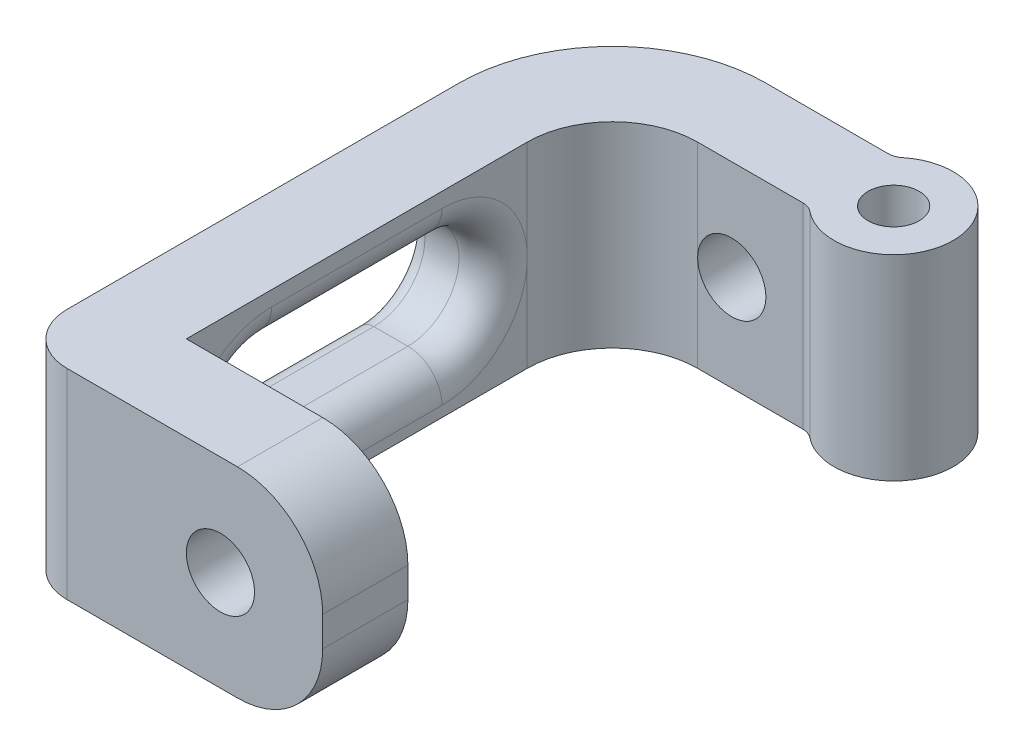
ISO-10303-21;
HEADER;
FILE_DESCRIPTION(('STEP AP214'),'2;1');
FILE_NAME('part.step','',(''),(''),'','','');
FILE_SCHEMA(('AUTOMOTIVE_DESIGN { 1 0 10303 214 1 1 1 1 }'));
ENDSEC;
DATA;
#1=APPLICATION_CONTEXT('core data for automotive mechanical design processes');
#2=APPLICATION_PROTOCOL_DEFINITION('international standard','automotive_design',2000,#1);
#3=PRODUCT_CONTEXT('',#1,'mechanical');
#4=PRODUCT('Part','Part','',(#3));
#5=PRODUCT_RELATED_PRODUCT_CATEGORY('part','',(#4));
#6=PRODUCT_DEFINITION_FORMATION('','',#4);
#7=PRODUCT_DEFINITION_CONTEXT('part definition',#1,'design');
#8=PRODUCT_DEFINITION('design','',#6,#7);
#9=PRODUCT_DEFINITION_SHAPE('','',#8);
#10=(LENGTH_UNIT() NAMED_UNIT(*) SI_UNIT(.MILLI.,.METRE.));
#11=(NAMED_UNIT(*) PLANE_ANGLE_UNIT() SI_UNIT($,.RADIAN.));
#12=(NAMED_UNIT(*) SI_UNIT($,.STERADIAN.) SOLID_ANGLE_UNIT());
#13=UNCERTAINTY_MEASURE_WITH_UNIT(LENGTH_MEASURE(1.E-05),#10,'distance_accuracy_value','');
#14=(GEOMETRIC_REPRESENTATION_CONTEXT(3) GLOBAL_UNCERTAINTY_ASSIGNED_CONTEXT((#13)) GLOBAL_UNIT_ASSIGNED_CONTEXT((#10,
#11,#12)) REPRESENTATION_CONTEXT('',''));
#15=CARTESIAN_POINT('',(0.,0.,0.));
#16=DIRECTION('',(0.,0.,1.));
#17=DIRECTION('',(1.,0.,0.));
#18=AXIS2_PLACEMENT_3D('',#15,#16,#17);
#19=CARTESIAN_POINT('',(-5.,5.75,30.));
#20=DIRECTION('',(-1.,0.,0.));
#21=DIRECTION('',(0.,-1.,0.));
#22=AXIS2_PLACEMENT_3D('',#19,#20,#21);
#23=PLANE('',#22);
#24=DIRECTION('',(0.,0.,-1.));
#25=VECTOR('',#24,1.);
#26=CARTESIAN_POINT('',(-5.,-5.75,30.));
#27=LINE('',#26,#25);
#28=CARTESIAN_POINT('',(-5.,-5.75,30.));
#29=VERTEX_POINT('',#28);
#30=CARTESIAN_POINT('',(-5.,-5.75,10.));
#31=VERTEX_POINT('',#30);
#32=EDGE_CURVE('E253',#29,#31,#27,.T.);
#33=ORIENTED_EDGE('',*,*,#32,.T.);
#34=DIRECTION('',(0.,1.,0.));
#35=VECTOR('',#34,1.);
#36=CARTESIAN_POINT('',(-5.,5.75,10.));
#37=LINE('',#36,#35);
#38=CARTESIAN_POINT('',(-5.,-0.124999999999997,10.));
#39=VERTEX_POINT('',#38);
#40=EDGE_CURVE('E386',#31,#39,#37,.T.);
#41=ORIENTED_EDGE('',*,*,#40,.T.);
#42=CARTESIAN_POINT('',(-5.,-0.124999999999997,15.));
#43=DIRECTION('',(-1.,0.,0.));
#44=DIRECTION('',(0.,-1.,0.));
#45=AXIS2_PLACEMENT_3D('',#42,#43,#44);
#46=CIRCLE('',#45,5.);
#47=CARTESIAN_POINT('',(-5.,-5.125,15.));
#48=VERTEX_POINT('',#47);
#49=EDGE_CURVE('E334',#39,#48,#46,.T.);
#50=ORIENTED_EDGE('',*,*,#49,.T.);
#51=DIRECTION('',(0.,0.,1.));
#52=VECTOR('',#51,1.);
#53=CARTESIAN_POINT('',(-5.,-5.125,30.));
#54=LINE('',#53,#52);
#55=CARTESIAN_POINT('',(-5.,-5.125,25.));
#56=VERTEX_POINT('',#55);
#57=EDGE_CURVE('E317',#48,#56,#54,.T.);
#58=ORIENTED_EDGE('',*,*,#57,.T.);
#59=CARTESIAN_POINT('',(-5.,-0.124999999999997,25.));
#60=DIRECTION('',(-1.,0.,0.));
#61=DIRECTION('',(0.,-1.,0.));
#62=AXIS2_PLACEMENT_3D('',#59,#60,#61);
#63=CIRCLE('',#62,5.);
#64=CARTESIAN_POINT('',(-5.,-0.124999999999997,30.));
#65=VERTEX_POINT('',#64);
#66=EDGE_CURVE('E332',#56,#65,#63,.T.);
#67=ORIENTED_EDGE('',*,*,#66,.T.);
#68=DIRECTION('',(0.,1.,0.));
#69=VECTOR('',#68,1.);
#70=CARTESIAN_POINT('',(-5.,5.75,30.));
#71=LINE('',#70,#69);
#72=EDGE_CURVE('E247',#29,#65,#71,.T.);
#73=ORIENTED_EDGE('',*,*,#72,.F.);
#74=EDGE_LOOP('',(#33,#41,#50,#58,#67,#73));
#75=FACE_BOUND('',#74,.T.);
#76=ADVANCED_FACE('F45',(#75),#23,.F.);
#77=CARTESIAN_POINT('',(-10.,5.75,5.));
#78=DIRECTION('',(0.,-1.,0.));
#79=DIRECTION('',(0.,0.,-1.));
#80=AXIS2_PLACEMENT_3D('',#77,#78,#79);
#81=PLANE('',#80);
#82=CARTESIAN_POINT('',(9.,5.75,2.5));
#83=DIRECTION('',(0.,-1.,0.));
#84=DIRECTION('',(0.,0.,-1.));
#85=AXIS2_PLACEMENT_3D('',#82,#83,#84);
#86=CIRCLE('',#85,1.5);
#87=CARTESIAN_POINT('',(9.,5.75,1.));
#88=VERTEX_POINT('',#87);
#89=EDGE_CURVE('E356',#88,#88,#86,.T.);
#90=ORIENTED_EDGE('',*,*,#89,.T.);
#91=EDGE_LOOP('',(#90));
#92=FACE_BOUND('',#91,.T.);
#93=DIRECTION('',(0.,0.,-1.));
#94=VECTOR('',#93,1.);
#95=CARTESIAN_POINT('',(-10.,5.75,5.));
#96=LINE('',#95,#94);
#97=CARTESIAN_POINT('',(-10.,5.75,32.));
#98=VERTEX_POINT('',#97);
#99=CARTESIAN_POINT('',(-10.,5.75,9.));
#100=VERTEX_POINT('',#99);
#101=EDGE_CURVE('E267',#98,#100,#96,.T.);
#102=ORIENTED_EDGE('',*,*,#101,.F.);
#103=CARTESIAN_POINT('',(-7.,5.75,32.));
#104=DIRECTION('',(0.,-1.,0.));
#105=DIRECTION('',(0.,0.,-1.));
#106=AXIS2_PLACEMENT_3D('',#103,#104,#105);
#107=CIRCLE('',#106,3.);
#108=CARTESIAN_POINT('',(-7.,5.75,35.));
#109=VERTEX_POINT('',#108);
#110=EDGE_CURVE('E12',#98,#109,#107,.F.);
#111=ORIENTED_EDGE('',*,*,#110,.T.);
#112=DIRECTION('',(-1.,0.,0.));
#113=VECTOR('',#112,1.);
#114=CARTESIAN_POINT('',(-10.,5.75,35.));
#115=LINE('',#114,#113);
#116=CARTESIAN_POINT('',(3.,5.75,35.));
#117=VERTEX_POINT('',#116);
#118=EDGE_CURVE('E219',#117,#109,#115,.T.);
#119=ORIENTED_EDGE('',*,*,#118,.F.);
#120=DIRECTION('',(0.,0.,-1.));
#121=VECTOR('',#120,1.);
#122=CARTESIAN_POINT('',(3.,5.75,5.));
#123=LINE('',#122,#121);
#124=CARTESIAN_POINT('',(3.,5.75,30.));
#125=VERTEX_POINT('',#124);
#126=EDGE_CURVE('E293',#117,#125,#123,.T.);
#127=ORIENTED_EDGE('',*,*,#126,.T.);
#128=DIRECTION('',(-1.,0.,0.));
#129=VECTOR('',#128,1.);
#130=CARTESIAN_POINT('',(-10.,5.75,30.));
#131=LINE('',#130,#129);
#132=CARTESIAN_POINT('',(-5.,5.75,30.));
#133=VERTEX_POINT('',#132);
#134=EDGE_CURVE('E238',#125,#133,#131,.T.);
#135=ORIENTED_EDGE('',*,*,#134,.T.);
#136=DIRECTION('',(0.,0.,-1.));
#137=VECTOR('',#136,1.);
#138=CARTESIAN_POINT('',(-5.,5.75,30.));
#139=LINE('',#138,#137);
#140=CARTESIAN_POINT('',(-5.,5.75,10.));
#141=VERTEX_POINT('',#140);
#142=EDGE_CURVE('E250',#133,#141,#139,.T.);
#143=ORIENTED_EDGE('',*,*,#142,.T.);
#144=CARTESIAN_POINT('',(0.,5.75,10.));
#145=DIRECTION('',(0.,-1.,0.));
#146=DIRECTION('',(0.,0.,-1.));
#147=AXIS2_PLACEMENT_3D('',#144,#145,#146);
#148=CIRCLE('',#147,5.);
#149=CARTESIAN_POINT('',(0.,5.75,5.));
#150=VERTEX_POINT('',#149);
#151=EDGE_CURVE('E393',#141,#150,#148,.T.);
#152=ORIENTED_EDGE('',*,*,#151,.T.);
#153=DIRECTION('',(-1.,0.,0.));
#154=VECTOR('',#153,1.);
#155=CARTESIAN_POINT('',(-10.,5.75,5.));
#156=LINE('',#155,#154);
#157=CARTESIAN_POINT('',(6.17157287525381,5.75,5.));
#158=VERTEX_POINT('',#157);
#159=EDGE_CURVE('E257',#158,#150,#156,.T.);
#160=ORIENTED_EDGE('',*,*,#159,.F.);
#161=CARTESIAN_POINT('',(6.17157287525381,5.75,6.));
#162=DIRECTION('',(0.,-1.,0.));
#163=DIRECTION('',(0.,0.,-1.));
#164=AXIS2_PLACEMENT_3D('',#161,#162,#163);
#165=CIRCLE('',#164,1.);
#166=CARTESIAN_POINT('',(6.80011223630852,5.75,5.22222222222222));
#167=VERTEX_POINT('',#166);
#168=EDGE_CURVE('E382',#158,#167,#165,.T.);
#169=ORIENTED_EDGE('',*,*,#168,.T.);
#170=CARTESIAN_POINT('',(9.,5.75,2.5));
#171=DIRECTION('',(0.,-1.,0.));
#172=DIRECTION('',(0.,0.,-1.));
#173=AXIS2_PLACEMENT_3D('',#170,#171,#172);
#174=CIRCLE('',#173,3.5);
#175=CARTESIAN_POINT('',(6.80011223630852,5.75,-0.222222222222222));
#176=VERTEX_POINT('',#175);
#177=EDGE_CURVE('E433',#176,#167,#174,.T.);
#178=ORIENTED_EDGE('',*,*,#177,.F.);
#179=CARTESIAN_POINT('',(6.17157287525381,5.75,-1.));
#180=DIRECTION('',(0.,-1.,0.));
#181=DIRECTION('',(0.,0.,-1.));
#182=AXIS2_PLACEMENT_3D('',#179,#180,#181);
#183=CIRCLE('',#182,1.);
#184=CARTESIAN_POINT('',(6.17157287525381,5.75,0.));
#185=VERTEX_POINT('',#184);
#186=EDGE_CURVE('E377',#176,#185,#183,.T.);
#187=ORIENTED_EDGE('',*,*,#186,.T.);
#188=DIRECTION('',(-1.,0.,0.));
#189=VECTOR('',#188,1.);
#190=CARTESIAN_POINT('',(-10.,5.75,0.));
#191=LINE('',#190,#189);
#192=CARTESIAN_POINT('',(-1.,5.75,0.));
#193=VERTEX_POINT('',#192);
#194=EDGE_CURVE('E256',#185,#193,#191,.T.);
#195=ORIENTED_EDGE('',*,*,#194,.T.);
#196=CARTESIAN_POINT('',(-1.,5.75,9.));
#197=DIRECTION('',(0.,-1.,0.));
#198=DIRECTION('',(0.,0.,-1.));
#199=AXIS2_PLACEMENT_3D('',#196,#197,#198);
#200=CIRCLE('',#199,9.);
#201=EDGE_CURVE('E276',#193,#100,#200,.F.);
#202=ORIENTED_EDGE('',*,*,#201,.T.);
#203=EDGE_LOOP('',(#102,#111,#119,#127,#135,#143,#152,#160,#169,#178,#187,#195,#202));
#204=FACE_BOUND('',#203,.T.);
#205=ADVANCED_FACE('F458',(#92,#204),#81,.F.);
#206=CARTESIAN_POINT('',(-10.,5.75,5.));
#207=DIRECTION('',(1.,0.,0.));
#208=DIRECTION('',(0.,0.,-1.));
#209=AXIS2_PLACEMENT_3D('',#206,#207,#208);
#210=PLANE('',#209);
#211=CARTESIAN_POINT('',(-10.,-0.124999999999998,25.));
#212=DIRECTION('',(1.,0.,0.));
#213=DIRECTION('',(0.,0.,-1.));
#214=AXIS2_PLACEMENT_3D('',#211,#212,#213);
#215=CIRCLE('',#214,4.);
#216=CARTESIAN_POINT('',(-10.,3.875,25.));
#217=VERTEX_POINT('',#216);
#218=CARTESIAN_POINT('',(-10.,-4.125,25.));
#219=VERTEX_POINT('',#218);
#220=EDGE_CURVE('E299',#217,#219,#215,.T.);
#221=ORIENTED_EDGE('',*,*,#220,.T.);
#222=DIRECTION('',(0.,0.,1.));
#223=VECTOR('',#222,1.);
#224=CARTESIAN_POINT('',(-10.,-4.125,5.));
#225=LINE('',#224,#223);
#226=CARTESIAN_POINT('',(-10.,-4.125,15.));
#227=VERTEX_POINT('',#226);
#228=EDGE_CURVE('E305',#219,#227,#225,.F.);
#229=ORIENTED_EDGE('',*,*,#228,.T.);
#230=CARTESIAN_POINT('',(-10.,-0.124999999999998,15.));
#231=DIRECTION('',(1.,0.,0.));
#232=DIRECTION('',(0.,0.,-1.));
#233=AXIS2_PLACEMENT_3D('',#230,#231,#232);
#234=CIRCLE('',#233,4.);
#235=CARTESIAN_POINT('',(-10.,3.875,15.));
#236=VERTEX_POINT('',#235);
#237=EDGE_CURVE('E303',#227,#236,#234,.T.);
#238=ORIENTED_EDGE('',*,*,#237,.T.);
#239=DIRECTION('',(0.,0.,-1.));
#240=VECTOR('',#239,1.);
#241=CARTESIAN_POINT('',(-10.,3.875,5.));
#242=LINE('',#241,#240);
#243=EDGE_CURVE('E301',#236,#217,#242,.F.);
#244=ORIENTED_EDGE('',*,*,#243,.T.);
#245=EDGE_LOOP('',(#221,#229,#238,#244));
#246=FACE_BOUND('',#245,.T.);
#247=DIRECTION('',(0.,0.,-1.));
#248=VECTOR('',#247,1.);
#249=CARTESIAN_POINT('',(-10.,-6.,35.));
#250=LINE('',#249,#248);
#251=CARTESIAN_POINT('',(-10.,-6.,32.));
#252=VERTEX_POINT('',#251);
#253=CARTESIAN_POINT('',(-10.,-6.,30.));
#254=VERTEX_POINT('',#253);
#255=EDGE_CURVE('E211',#252,#254,#250,.T.);
#256=ORIENTED_EDGE('',*,*,#255,.F.);
#257=DIRECTION('',(0.,-1.,0.));
#258=VECTOR('',#257,1.);
#259=CARTESIAN_POINT('',(-10.,5.75,32.));
#260=LINE('',#259,#258);
#261=EDGE_CURVE('E53',#252,#98,#260,.F.);
#262=ORIENTED_EDGE('',*,*,#261,.T.);
#263=ORIENTED_EDGE('',*,*,#101,.T.);
#264=DIRECTION('',(0.,-1.,0.));
#265=VECTOR('',#264,1.);
#266=CARTESIAN_POINT('',(-10.,5.75,9.));
#267=LINE('',#266,#265);
#268=CARTESIAN_POINT('',(-10.,-5.75,9.));
#269=VERTEX_POINT('',#268);
#270=EDGE_CURVE('E269',#100,#269,#267,.T.);
#271=ORIENTED_EDGE('',*,*,#270,.T.);
#272=DIRECTION('',(0.,0.,-1.));
#273=VECTOR('',#272,1.);
#274=CARTESIAN_POINT('',(-10.,-5.75,5.));
#275=LINE('',#274,#273);
#276=CARTESIAN_POINT('',(-10.,-5.75,30.));
#277=VERTEX_POINT('',#276);
#278=EDGE_CURVE('E226',#277,#269,#275,.T.);
#279=ORIENTED_EDGE('',*,*,#278,.F.);
#280=DIRECTION('',(0.,-1.,0.));
#281=VECTOR('',#280,1.);
#282=CARTESIAN_POINT('',(-10.,5.75,30.));
#283=LINE('',#282,#281);
#284=EDGE_CURVE('E222',#277,#254,#283,.T.);
#285=ORIENTED_EDGE('',*,*,#284,.T.);
#286=EDGE_LOOP('',(#256,#262,#263,#271,#279,#285));
#287=FACE_BOUND('',#286,.T.);
#288=ADVANCED_FACE('F223',(#246,#287),#210,.F.);
#289=CARTESIAN_POINT('',(-10.,-5.75,5.));
#290=DIRECTION('',(0.,1.,0.));
#291=DIRECTION('',(0.,0.,1.));
#292=AXIS2_PLACEMENT_3D('',#289,#290,#291);
#293=PLANE('',#292);
#294=CARTESIAN_POINT('',(9.,-5.75,2.5));
#295=DIRECTION('',(0.,1.,0.));
#296=DIRECTION('',(0.,0.,1.));
#297=AXIS2_PLACEMENT_3D('',#294,#295,#296);
#298=CIRCLE('',#297,1.5);
#299=CARTESIAN_POINT('',(9.,-5.75,4.));
#300=VERTEX_POINT('',#299);
#301=EDGE_CURVE('E351',#300,#300,#298,.T.);
#302=ORIENTED_EDGE('',*,*,#301,.T.);
#303=EDGE_LOOP('',(#302));
#304=FACE_BOUND('',#303,.T.);
#305=DIRECTION('',(1.,0.,0.));
#306=VECTOR('',#305,1.);
#307=CARTESIAN_POINT('',(-10.,-5.75,0.));
#308=LINE('',#307,#306);
#309=CARTESIAN_POINT('',(-1.,-5.75,0.));
#310=VERTEX_POINT('',#309);
#311=CARTESIAN_POINT('',(6.17157287525381,-5.75,0.));
#312=VERTEX_POINT('',#311);
#313=EDGE_CURVE('E261',#310,#312,#308,.T.);
#314=ORIENTED_EDGE('',*,*,#313,.T.);
#315=CARTESIAN_POINT('',(6.17157287525381,-5.75,-1.));
#316=DIRECTION('',(0.,1.,0.));
#317=DIRECTION('',(0.,0.,1.));
#318=AXIS2_PLACEMENT_3D('',#315,#316,#317);
#319=CIRCLE('',#318,1.);
#320=CARTESIAN_POINT('',(6.80011223630852,-5.75,-0.222222222222222));
#321=VERTEX_POINT('',#320);
#322=EDGE_CURVE('E375',#312,#321,#319,.T.);
#323=ORIENTED_EDGE('',*,*,#322,.T.);
#324=CARTESIAN_POINT('',(9.,-5.75,2.5));
#325=DIRECTION('',(0.,-1.,0.));
#326=DIRECTION('',(0.,0.,-1.));
#327=AXIS2_PLACEMENT_3D('',#324,#325,#326);
#328=CIRCLE('',#327,3.5);
#329=CARTESIAN_POINT('',(6.80011223630852,-5.75,5.22222222222222));
#330=VERTEX_POINT('',#329);
#331=EDGE_CURVE('E434',#321,#330,#328,.T.);
#332=ORIENTED_EDGE('',*,*,#331,.T.);
#333=CARTESIAN_POINT('',(6.17157287525381,-5.75,6.));
#334=DIRECTION('',(0.,1.,0.));
#335=DIRECTION('',(0.,0.,1.));
#336=AXIS2_PLACEMENT_3D('',#333,#334,#335);
#337=CIRCLE('',#336,1.);
#338=CARTESIAN_POINT('',(6.17157287525381,-5.75,5.));
#339=VERTEX_POINT('',#338);
#340=EDGE_CURVE('E379',#330,#339,#337,.T.);
#341=ORIENTED_EDGE('',*,*,#340,.T.);
#342=DIRECTION('',(1.,0.,0.));
#343=VECTOR('',#342,1.);
#344=CARTESIAN_POINT('',(-10.,-5.75,5.));
#345=LINE('',#344,#343);
#346=CARTESIAN_POINT('',(0.,-5.75,5.));
#347=VERTEX_POINT('',#346);
#348=EDGE_CURVE('E260',#347,#339,#345,.T.);
#349=ORIENTED_EDGE('',*,*,#348,.F.);
#350=CARTESIAN_POINT('',(0.,-5.75,10.));
#351=DIRECTION('',(0.,1.,0.));
#352=DIRECTION('',(0.,0.,1.));
#353=AXIS2_PLACEMENT_3D('',#350,#351,#352);
#354=CIRCLE('',#353,5.);
#355=EDGE_CURVE('E395',#347,#31,#354,.T.);
#356=ORIENTED_EDGE('',*,*,#355,.T.);
#357=ORIENTED_EDGE('',*,*,#32,.F.);
#358=DIRECTION('',(1.,0.,0.));
#359=VECTOR('',#358,1.);
#360=CARTESIAN_POINT('',(-10.,-5.75,30.));
#361=LINE('',#360,#359);
#362=EDGE_CURVE('E218',#277,#29,#361,.T.);
#363=ORIENTED_EDGE('',*,*,#362,.F.);
#364=ORIENTED_EDGE('',*,*,#278,.T.);
#365=CARTESIAN_POINT('',(-1.,-5.75,9.));
#366=DIRECTION('',(0.,1.,0.));
#367=DIRECTION('',(0.,0.,1.));
#368=AXIS2_PLACEMENT_3D('',#365,#366,#367);
#369=CIRCLE('',#368,9.);
#370=EDGE_CURVE('E271',#269,#310,#369,.F.);
#371=ORIENTED_EDGE('',*,*,#370,.T.);
#372=EDGE_LOOP('',(#314,#323,#332,#341,#349,#356,#357,#363,#364,#371));
#373=FACE_BOUND('',#372,.T.);
#374=ADVANCED_FACE('F452',(#304,#373),#293,.F.);
#375=CARTESIAN_POINT('',(0.,0.,5.));
#376=DIRECTION('',(0.,0.,1.));
#377=DIRECTION('',(1.,0.,0.));
#378=AXIS2_PLACEMENT_3D('',#375,#376,#377);
#379=PLANE('',#378);
#380=ORIENTED_EDGE('',*,*,#159,.T.);
#381=DIRECTION('',(0.,1.,0.));
#382=VECTOR('',#381,1.);
#383=CARTESIAN_POINT('',(0.,0.,5.));
#384=LINE('',#383,#382);
#385=CARTESIAN_POINT('',(0.,-0.125000000000001,5.));
#386=VERTEX_POINT('',#385);
#387=EDGE_CURVE('E391',#150,#386,#384,.F.);
#388=ORIENTED_EDGE('',*,*,#387,.T.);
#389=CARTESIAN_POINT('',(2.,-0.125000000000001,5.));
#390=DIRECTION('',(0.,0.,1.));
#391=DIRECTION('',(1.,0.,0.));
#392=AXIS2_PLACEMENT_3D('',#389,#390,#391);
#393=CIRCLE('',#392,2.);
#394=EDGE_CURVE('E416',#386,#386,#393,.T.);
#395=ORIENTED_EDGE('',*,*,#394,.F.);
#396=DIRECTION('',(0.,1.,0.));
#397=VECTOR('',#396,1.);
#398=CARTESIAN_POINT('',(0.,0.,5.));
#399=LINE('',#398,#397);
#400=EDGE_CURVE('E389',#386,#347,#399,.F.);
#401=ORIENTED_EDGE('',*,*,#400,.T.);
#402=ORIENTED_EDGE('',*,*,#348,.T.);
#403=DIRECTION('',(0.,1.,0.));
#404=VECTOR('',#403,1.);
#405=CARTESIAN_POINT('',(6.17157287525381,5.75,5.));
#406=LINE('',#405,#404);
#407=EDGE_CURVE('E373',#339,#158,#406,.T.);
#408=ORIENTED_EDGE('',*,*,#407,.T.);
#409=EDGE_LOOP('',(#380,#388,#395,#401,#402,#408));
#410=FACE_BOUND('',#409,.T.);
#411=ADVANCED_FACE('F497',(#410),#379,.T.);
#412=CARTESIAN_POINT('',(0.,0.,0.));
#413=DIRECTION('',(0.,0.,1.));
#414=DIRECTION('',(1.,0.,0.));
#415=AXIS2_PLACEMENT_3D('',#412,#413,#414);
#416=PLANE('',#415);
#417=CARTESIAN_POINT('',(2.,-0.125000000000001,0.));
#418=DIRECTION('',(0.,0.,-1.));
#419=DIRECTION('',(-1.,0.,0.));
#420=AXIS2_PLACEMENT_3D('',#417,#418,#419);
#421=CIRCLE('',#420,2.);
#422=CARTESIAN_POINT('',(0.,-0.125000000000001,0.));
#423=VERTEX_POINT('',#422);
#424=EDGE_CURVE('E330',#423,#423,#421,.T.);
#425=ORIENTED_EDGE('',*,*,#424,.F.);
#426=EDGE_LOOP('',(#425));
#427=FACE_BOUND('',#426,.T.);
#428=ORIENTED_EDGE('',*,*,#194,.F.);
#429=DIRECTION('',(0.,-1.,0.));
#430=VECTOR('',#429,1.);
#431=CARTESIAN_POINT('',(6.17157287525381,0.,0.));
#432=LINE('',#431,#430);
#433=EDGE_CURVE('E365',#185,#312,#432,.T.);
#434=ORIENTED_EDGE('',*,*,#433,.T.);
#435=ORIENTED_EDGE('',*,*,#313,.F.);
#436=DIRECTION('',(0.,-1.,0.));
#437=VECTOR('',#436,1.);
#438=CARTESIAN_POINT('',(-1.,0.,0.));
#439=LINE('',#438,#437);
#440=EDGE_CURVE('E273',#310,#193,#439,.F.);
#441=ORIENTED_EDGE('',*,*,#440,.T.);
#442=EDGE_LOOP('',(#428,#434,#435,#441));
#443=FACE_BOUND('',#442,.T.);
#444=ADVANCED_FACE('F460',(#427,#443),#416,.F.);
#445=CARTESIAN_POINT('',(-5.,4.875,15.));
#446=VERTEX_POINT('',#445);
#447=EDGE_CURVE('E335',#446,#39,#46,.T.);
#448=ORIENTED_EDGE('',*,*,#447,.T.);
#449=DIRECTION('',(0.,1.,0.));
#450=VECTOR('',#449,1.);
#451=CARTESIAN_POINT('',(-5.,5.75,10.));
#452=LINE('',#451,#450);
#453=EDGE_CURVE('E384',#39,#141,#452,.T.);
#454=ORIENTED_EDGE('',*,*,#453,.T.);
#455=ORIENTED_EDGE('',*,*,#142,.F.);
#456=EDGE_CURVE('E246',#65,#133,#71,.T.);
#457=ORIENTED_EDGE('',*,*,#456,.F.);
#458=CARTESIAN_POINT('',(-5.,-0.124999999999997,25.));
#459=DIRECTION('',(-1.,0.,0.));
#460=DIRECTION('',(0.,-1.,0.));
#461=AXIS2_PLACEMENT_3D('',#458,#459,#460);
#462=CIRCLE('',#461,5.);
#463=CARTESIAN_POINT('',(-5.,4.875,25.));
#464=VERTEX_POINT('',#463);
#465=EDGE_CURVE('E338',#65,#464,#462,.T.);
#466=ORIENTED_EDGE('',*,*,#465,.T.);
#467=DIRECTION('',(0.,0.,-1.));
#468=VECTOR('',#467,1.);
#469=CARTESIAN_POINT('',(-5.,4.875,30.));
#470=LINE('',#469,#468);
#471=EDGE_CURVE('E340',#464,#446,#470,.T.);
#472=ORIENTED_EDGE('',*,*,#471,.T.);
#473=EDGE_LOOP('',(#448,#454,#455,#457,#466,#472));
#474=FACE_BOUND('',#473,.T.);
#475=ADVANCED_FACE('F477',(#474),#23,.F.);
#476=CARTESIAN_POINT('',(0.,0.,30.));
#477=DIRECTION('',(0.,0.,1.));
#478=DIRECTION('',(1.,0.,0.));
#479=AXIS2_PLACEMENT_3D('',#476,#477,#478);
#480=PLANE('',#479);
#481=CARTESIAN_POINT('',(2.,-0.125000000000001,30.));
#482=DIRECTION('',(0.,0.,1.));
#483=DIRECTION('',(1.,0.,0.));
#484=AXIS2_PLACEMENT_3D('',#481,#482,#483);
#485=CIRCLE('',#484,2.);
#486=CARTESIAN_POINT('',(4.,-0.125000000000001,30.));
#487=VERTEX_POINT('',#486);
#488=EDGE_CURVE('E423',#487,#487,#485,.T.);
#489=ORIENTED_EDGE('',*,*,#488,.T.);
#490=EDGE_LOOP('',(#489));
#491=FACE_BOUND('',#490,.T.);
#492=DIRECTION('',(0.,1.,0.));
#493=VECTOR('',#492,1.);
#494=CARTESIAN_POINT('',(8.,5.75,30.));
#495=LINE('',#494,#493);
#496=CARTESIAN_POINT('',(8.,-0.999999999999999,30.));
#497=VERTEX_POINT('',#496);
#498=CARTESIAN_POINT('',(8.,0.75,30.));
#499=VERTEX_POINT('',#498);
#500=EDGE_CURVE('E235',#497,#499,#495,.T.);
#501=ORIENTED_EDGE('',*,*,#500,.F.);
#502=CARTESIAN_POINT('',(3.,-1.,30.));
#503=DIRECTION('',(0.,0.,1.));
#504=DIRECTION('',(1.,0.,0.));
#505=AXIS2_PLACEMENT_3D('',#502,#503,#504);
#506=CIRCLE('',#505,5.);
#507=CARTESIAN_POINT('',(3.,-6.,30.));
#508=VERTEX_POINT('',#507);
#509=EDGE_CURVE('E234',#497,#508,#506,.F.);
#510=ORIENTED_EDGE('',*,*,#509,.T.);
#511=DIRECTION('',(1.,0.,0.));
#512=VECTOR('',#511,1.);
#513=CARTESIAN_POINT('',(-10.,-6.,30.));
#514=LINE('',#513,#512);
#515=EDGE_CURVE('E216',#254,#508,#514,.T.);
#516=ORIENTED_EDGE('',*,*,#515,.F.);
#517=ORIENTED_EDGE('',*,*,#284,.F.);
#518=ORIENTED_EDGE('',*,*,#362,.T.);
#519=ORIENTED_EDGE('',*,*,#72,.T.);
#520=ORIENTED_EDGE('',*,*,#456,.T.);
#521=ORIENTED_EDGE('',*,*,#134,.F.);
#522=CARTESIAN_POINT('',(3.,0.749999999999999,30.));
#523=DIRECTION('',(0.,0.,1.));
#524=DIRECTION('',(1.,0.,0.));
#525=AXIS2_PLACEMENT_3D('',#522,#523,#524);
#526=CIRCLE('',#525,5.);
#527=EDGE_CURVE('E284',#125,#499,#526,.F.);
#528=ORIENTED_EDGE('',*,*,#527,.T.);
#529=EDGE_LOOP('',(#501,#510,#516,#517,#518,#519,#520,#521,#528));
#530=FACE_BOUND('',#529,.T.);
#531=ADVANCED_FACE('F233',(#491,#530),#480,.F.);
#532=CARTESIAN_POINT('',(-10.,-6.,35.));
#533=DIRECTION('',(0.,1.,0.));
#534=DIRECTION('',(0.,0.,1.));
#535=AXIS2_PLACEMENT_3D('',#532,#533,#534);
#536=PLANE('',#535);
#537=DIRECTION('',(1.,0.,0.));
#538=VECTOR('',#537,1.);
#539=CARTESIAN_POINT('',(-10.,-6.,35.));
#540=LINE('',#539,#538);
#541=CARTESIAN_POINT('',(-7.,-6.,35.));
#542=VERTEX_POINT('',#541);
#543=CARTESIAN_POINT('',(3.,-6.,35.));
#544=VERTEX_POINT('',#543);
#545=EDGE_CURVE('E243',#542,#544,#540,.T.);
#546=ORIENTED_EDGE('',*,*,#545,.F.);
#547=CARTESIAN_POINT('',(-7.,-6.,32.));
#548=DIRECTION('',(0.,1.,0.));
#549=DIRECTION('',(0.,0.,1.));
#550=AXIS2_PLACEMENT_3D('',#547,#548,#549);
#551=CIRCLE('',#550,3.);
#552=EDGE_CURVE('E67',#542,#252,#551,.F.);
#553=ORIENTED_EDGE('',*,*,#552,.T.);
#554=ORIENTED_EDGE('',*,*,#255,.T.);
#555=ORIENTED_EDGE('',*,*,#515,.T.);
#556=DIRECTION('',(0.,0.,-1.));
#557=VECTOR('',#556,1.);
#558=CARTESIAN_POINT('',(3.,-6.,35.));
#559=LINE('',#558,#557);
#560=EDGE_CURVE('E287',#508,#544,#559,.F.);
#561=ORIENTED_EDGE('',*,*,#560,.T.);
#562=EDGE_LOOP('',(#546,#553,#554,#555,#561));
#563=FACE_BOUND('',#562,.T.);
#564=ADVANCED_FACE('F213',(#563),#536,.F.);
#565=CARTESIAN_POINT('',(8.,5.75,35.));
#566=DIRECTION('',(-1.,0.,0.));
#567=DIRECTION('',(0.,-1.,0.));
#568=AXIS2_PLACEMENT_3D('',#565,#566,#567);
#569=PLANE('',#568);
#570=DIRECTION('',(0.,1.,0.));
#571=VECTOR('',#570,1.);
#572=CARTESIAN_POINT('',(8.,5.75,35.));
#573=LINE('',#572,#571);
#574=CARTESIAN_POINT('',(8.,-0.999999999999999,35.));
#575=VERTEX_POINT('',#574);
#576=CARTESIAN_POINT('',(8.,0.75,35.));
#577=VERTEX_POINT('',#576);
#578=EDGE_CURVE('E408',#575,#577,#573,.T.);
#579=ORIENTED_EDGE('',*,*,#578,.F.);
#580=DIRECTION('',(0.,0.,-1.));
#581=VECTOR('',#580,1.);
#582=CARTESIAN_POINT('',(8.,-0.999999999999999,35.));
#583=LINE('',#582,#581);
#584=EDGE_CURVE('E281',#575,#497,#583,.T.);
#585=ORIENTED_EDGE('',*,*,#584,.T.);
#586=ORIENTED_EDGE('',*,*,#500,.T.);
#587=DIRECTION('',(0.,0.,-1.));
#588=VECTOR('',#587,1.);
#589=CARTESIAN_POINT('',(8.,0.75,35.));
#590=LINE('',#589,#588);
#591=EDGE_CURVE('E279',#499,#577,#590,.F.);
#592=ORIENTED_EDGE('',*,*,#591,.T.);
#593=EDGE_LOOP('',(#579,#585,#586,#592));
#594=FACE_BOUND('',#593,.T.);
#595=ADVANCED_FACE('F554',(#594),#569,.F.);
#596=CARTESIAN_POINT('',(0.,0.,35.));
#597=DIRECTION('',(0.,0.,1.));
#598=DIRECTION('',(1.,0.,0.));
#599=AXIS2_PLACEMENT_3D('',#596,#597,#598);
#600=PLANE('',#599);
#601=CARTESIAN_POINT('',(2.,-0.125000000000001,35.));
#602=DIRECTION('',(0.,0.,-1.));
#603=DIRECTION('',(-1.,0.,0.));
#604=AXIS2_PLACEMENT_3D('',#601,#602,#603);
#605=CIRCLE('',#604,2.);
#606=CARTESIAN_POINT('',(0.,-0.125000000000001,35.));
#607=VERTEX_POINT('',#606);
#608=EDGE_CURVE('E426',#607,#607,#605,.T.);
#609=ORIENTED_EDGE('',*,*,#608,.T.);
#610=EDGE_LOOP('',(#609));
#611=FACE_BOUND('',#610,.T.);
#612=ORIENTED_EDGE('',*,*,#118,.T.);
#613=DIRECTION('',(0.,-1.,0.));
#614=VECTOR('',#613,1.);
#615=CARTESIAN_POINT('',(-7.,-6.,35.));
#616=LINE('',#615,#614);
#617=EDGE_CURVE('E397',#109,#542,#616,.T.);
#618=ORIENTED_EDGE('',*,*,#617,.T.);
#619=ORIENTED_EDGE('',*,*,#545,.T.);
#620=CARTESIAN_POINT('',(3.,-1.,35.));
#621=DIRECTION('',(0.,0.,1.));
#622=DIRECTION('',(1.,0.,0.));
#623=AXIS2_PLACEMENT_3D('',#620,#621,#622);
#624=CIRCLE('',#623,5.);
#625=EDGE_CURVE('E291',#544,#575,#624,.T.);
#626=ORIENTED_EDGE('',*,*,#625,.T.);
#627=ORIENTED_EDGE('',*,*,#578,.T.);
#628=CARTESIAN_POINT('',(3.,0.749999999999999,35.));
#629=DIRECTION('',(0.,0.,1.));
#630=DIRECTION('',(1.,0.,0.));
#631=AXIS2_PLACEMENT_3D('',#628,#629,#630);
#632=CIRCLE('',#631,5.);
#633=EDGE_CURVE('E289',#577,#117,#632,.T.);
#634=ORIENTED_EDGE('',*,*,#633,.T.);
#635=EDGE_LOOP('',(#612,#618,#619,#626,#627,#634));
#636=FACE_BOUND('',#635,.T.);
#637=ADVANCED_FACE('F403',(#611,#636),#600,.T.);
#638=CARTESIAN_POINT('',(-5.,-0.124999999999997,15.));
#639=DIRECTION('',(-1.,0.,0.));
#640=DIRECTION('',(0.,-1.,0.));
#641=AXIS2_PLACEMENT_3D('',#638,#639,#640);
#642=CYLINDRICAL_SURFACE('',#641,3.);
#643=DIRECTION('',(-1.,0.,0.));
#644=VECTOR('',#643,1.);
#645=CARTESIAN_POINT('',(-5.,-3.125,15.));
#646=LINE('',#645,#644);
#647=CARTESIAN_POINT('',(-7.,-3.125,15.));
#648=VERTEX_POINT('',#647);
#649=CARTESIAN_POINT('',(-9.,-3.125,15.));
#650=VERTEX_POINT('',#649);
#651=EDGE_CURVE('E413',#648,#650,#646,.T.);
#652=ORIENTED_EDGE('',*,*,#651,.F.);
#653=CARTESIAN_POINT('',(-7.,-0.124999999999998,15.));
#654=DIRECTION('',(-1.,0.,0.));
#655=DIRECTION('',(0.,-1.,0.));
#656=AXIS2_PLACEMENT_3D('',#653,#654,#655);
#657=CIRCLE('',#656,3.);
#658=CARTESIAN_POINT('',(-7.,2.875,15.));
#659=VERTEX_POINT('',#658);
#660=EDGE_CURVE('E342',#648,#659,#657,.F.);
#661=ORIENTED_EDGE('',*,*,#660,.T.);
#662=DIRECTION('',(-1.,0.,0.));
#663=VECTOR('',#662,1.);
#664=CARTESIAN_POINT('',(-5.,2.875,15.));
#665=LINE('',#664,#663);
#666=CARTESIAN_POINT('',(-9.,2.875,15.));
#667=VERTEX_POINT('',#666);
#668=EDGE_CURVE('E230',#659,#667,#665,.T.);
#669=ORIENTED_EDGE('',*,*,#668,.T.);
#670=CARTESIAN_POINT('',(-9.,-0.124999999999998,15.));
#671=DIRECTION('',(1.,0.,0.));
#672=DIRECTION('',(0.,0.,-1.));
#673=AXIS2_PLACEMENT_3D('',#670,#671,#672);
#674=CIRCLE('',#673,3.);
#675=EDGE_CURVE('E308',#667,#650,#674,.F.);
#676=ORIENTED_EDGE('',*,*,#675,.T.);
#677=EDGE_LOOP('',(#652,#661,#669,#676));
#678=FACE_BOUND('',#677,.T.);
#679=ADVANCED_FACE('F543',(#678),#642,.F.);
#680=CARTESIAN_POINT('',(-5.,2.875,15.));
#681=DIRECTION('',(0.,1.,0.));
#682=DIRECTION('',(-1.,0.,0.));
#683=AXIS2_PLACEMENT_3D('',#680,#681,#682);
#684=PLANE('',#683);
#685=ORIENTED_EDGE('',*,*,#668,.F.);
#686=DIRECTION('',(0.,0.,-1.));
#687=VECTOR('',#686,1.);
#688=CARTESIAN_POINT('',(-7.,2.875,15.));
#689=LINE('',#688,#687);
#690=CARTESIAN_POINT('',(-7.,2.875,25.));
#691=VERTEX_POINT('',#690);
#692=EDGE_CURVE('E345',#659,#691,#689,.F.);
#693=ORIENTED_EDGE('',*,*,#692,.T.);
#694=DIRECTION('',(-1.,0.,0.));
#695=VECTOR('',#694,1.);
#696=CARTESIAN_POINT('',(-5.,2.875,25.));
#697=LINE('',#696,#695);
#698=CARTESIAN_POINT('',(-9.,2.875,25.));
#699=VERTEX_POINT('',#698);
#700=EDGE_CURVE('E418',#691,#699,#697,.T.);
#701=ORIENTED_EDGE('',*,*,#700,.T.);
#702=DIRECTION('',(0.,0.,-1.));
#703=VECTOR('',#702,1.);
#704=CARTESIAN_POINT('',(-9.,2.875,15.));
#705=LINE('',#704,#703);
#706=EDGE_CURVE('E311',#699,#667,#705,.T.);
#707=ORIENTED_EDGE('',*,*,#706,.T.);
#708=EDGE_LOOP('',(#685,#693,#701,#707));
#709=FACE_BOUND('',#708,.T.);
#710=ADVANCED_FACE('F539',(#709),#684,.F.);
#711=CARTESIAN_POINT('',(-5.,-0.124999999999997,25.));
#712=DIRECTION('',(-1.,0.,0.));
#713=DIRECTION('',(0.,-1.,0.));
#714=AXIS2_PLACEMENT_3D('',#711,#712,#713);
#715=CYLINDRICAL_SURFACE('',#714,3.);
#716=ORIENTED_EDGE('',*,*,#700,.F.);
#717=CARTESIAN_POINT('',(-7.,-0.124999999999998,25.));
#718=DIRECTION('',(-1.,0.,0.));
#719=DIRECTION('',(0.,-1.,0.));
#720=AXIS2_PLACEMENT_3D('',#717,#718,#719);
#721=CIRCLE('',#720,3.);
#722=CARTESIAN_POINT('',(-7.,-3.125,25.));
#723=VERTEX_POINT('',#722);
#724=EDGE_CURVE('E347',#691,#723,#721,.F.);
#725=ORIENTED_EDGE('',*,*,#724,.T.);
#726=DIRECTION('',(-1.,0.,0.));
#727=VECTOR('',#726,1.);
#728=CARTESIAN_POINT('',(-5.,-3.125,25.));
#729=LINE('',#728,#727);
#730=CARTESIAN_POINT('',(-9.,-3.125,25.));
#731=VERTEX_POINT('',#730);
#732=EDGE_CURVE('E415',#723,#731,#729,.T.);
#733=ORIENTED_EDGE('',*,*,#732,.T.);
#734=CARTESIAN_POINT('',(-9.,-0.124999999999998,25.));
#735=DIRECTION('',(1.,0.,0.));
#736=DIRECTION('',(0.,0.,-1.));
#737=AXIS2_PLACEMENT_3D('',#734,#735,#736);
#738=CIRCLE('',#737,3.);
#739=EDGE_CURVE('E314',#731,#699,#738,.F.);
#740=ORIENTED_EDGE('',*,*,#739,.T.);
#741=EDGE_LOOP('',(#716,#725,#733,#740));
#742=FACE_BOUND('',#741,.T.);
#743=ADVANCED_FACE('F542',(#742),#715,.F.);
#744=CARTESIAN_POINT('',(-5.,-3.125,15.));
#745=DIRECTION('',(0.,-1.,0.));
#746=DIRECTION('',(1.,0.,0.));
#747=AXIS2_PLACEMENT_3D('',#744,#745,#746);
#748=PLANE('',#747);
#749=ORIENTED_EDGE('',*,*,#732,.F.);
#750=DIRECTION('',(0.,0.,1.));
#751=VECTOR('',#750,1.);
#752=CARTESIAN_POINT('',(-7.,-3.125,15.));
#753=LINE('',#752,#751);
#754=EDGE_CURVE('E349',#723,#648,#753,.F.);
#755=ORIENTED_EDGE('',*,*,#754,.T.);
#756=ORIENTED_EDGE('',*,*,#651,.T.);
#757=DIRECTION('',(0.,0.,1.));
#758=VECTOR('',#757,1.);
#759=CARTESIAN_POINT('',(-9.,-3.125,15.));
#760=LINE('',#759,#758);
#761=EDGE_CURVE('E296',#650,#731,#760,.T.);
#762=ORIENTED_EDGE('',*,*,#761,.T.);
#763=EDGE_LOOP('',(#749,#755,#756,#762));
#764=FACE_BOUND('',#763,.T.);
#765=ADVANCED_FACE('F533',(#764),#748,.F.);
#766=CARTESIAN_POINT('',(2.,-0.125000000000001,35.));
#767=DIRECTION('',(0.,0.,-1.));
#768=DIRECTION('',(-1.,0.,0.));
#769=AXIS2_PLACEMENT_3D('',#766,#767,#768);
#770=CYLINDRICAL_SURFACE('',#769,2.);
#771=ORIENTED_EDGE('',*,*,#608,.F.);
#772=EDGE_LOOP('',(#771));
#773=FACE_BOUND('',#772,.T.);
#774=ORIENTED_EDGE('',*,*,#488,.F.);
#775=EDGE_LOOP('',(#774));
#776=FACE_BOUND('',#775,.T.);
#777=ADVANCED_FACE('F523',(#773,#776),#770,.F.);
#778=ORIENTED_EDGE('',*,*,#394,.T.);
#779=EDGE_LOOP('',(#778));
#780=FACE_BOUND('',#779,.T.);
#781=ORIENTED_EDGE('',*,*,#424,.T.);
#782=EDGE_LOOP('',(#781));
#783=FACE_BOUND('',#782,.T.);
#784=ADVANCED_FACE('F521',(#780,#783),#770,.F.);
#785=CARTESIAN_POINT('',(-1.,5.75,9.));
#786=DIRECTION('',(0.,-1.,0.));
#787=DIRECTION('',(0.,0.,-1.));
#788=AXIS2_PLACEMENT_3D('',#785,#786,#787);
#789=CYLINDRICAL_SURFACE('',#788,9.);
#790=ORIENTED_EDGE('',*,*,#201,.F.);
#791=ORIENTED_EDGE('',*,*,#440,.F.);
#792=ORIENTED_EDGE('',*,*,#370,.F.);
#793=ORIENTED_EDGE('',*,*,#270,.F.);
#794=EDGE_LOOP('',(#790,#791,#792,#793));
#795=FACE_BOUND('',#794,.T.);
#796=ADVANCED_FACE('F466',(#795),#789,.T.);
#797=CARTESIAN_POINT('',(3.,-1.,35.));
#798=DIRECTION('',(0.,0.,-1.));
#799=DIRECTION('',(-1.,0.,0.));
#800=AXIS2_PLACEMENT_3D('',#797,#798,#799);
#801=CYLINDRICAL_SURFACE('',#800,5.);
#802=ORIENTED_EDGE('',*,*,#625,.F.);
#803=ORIENTED_EDGE('',*,*,#560,.F.);
#804=ORIENTED_EDGE('',*,*,#509,.F.);
#805=ORIENTED_EDGE('',*,*,#584,.F.);
#806=EDGE_LOOP('',(#802,#803,#804,#805));
#807=FACE_BOUND('',#806,.T.);
#808=ADVANCED_FACE('F530',(#807),#801,.T.);
#809=CARTESIAN_POINT('',(3.,0.749999999999999,5.));
#810=DIRECTION('',(0.,0.,-1.));
#811=DIRECTION('',(-1.,0.,0.));
#812=AXIS2_PLACEMENT_3D('',#809,#810,#811);
#813=CYLINDRICAL_SURFACE('',#812,5.);
#814=ORIENTED_EDGE('',*,*,#633,.F.);
#815=ORIENTED_EDGE('',*,*,#591,.F.);
#816=ORIENTED_EDGE('',*,*,#527,.F.);
#817=ORIENTED_EDGE('',*,*,#126,.F.);
#818=EDGE_LOOP('',(#814,#815,#816,#817));
#819=FACE_BOUND('',#818,.T.);
#820=ADVANCED_FACE('F626',(#819),#813,.T.);
#821=CARTESIAN_POINT('',(-9.,3.875,15.));
#822=DIRECTION('',(0.,0.,-1.));
#823=DIRECTION('',(-1.,0.,0.));
#824=AXIS2_PLACEMENT_3D('',#821,#822,#823);
#825=CYLINDRICAL_SURFACE('',#824,1.);
#826=CARTESIAN_POINT('',(-9.,3.875,25.));
#827=DIRECTION('',(0.,0.,1.));
#828=DIRECTION('',(1.,0.,0.));
#829=AXIS2_PLACEMENT_3D('',#826,#827,#828);
#830=CIRCLE('',#829,1.);
#831=EDGE_CURVE('E324',#217,#699,#830,.T.);
#832=ORIENTED_EDGE('',*,*,#831,.F.);
#833=ORIENTED_EDGE('',*,*,#243,.F.);
#834=CARTESIAN_POINT('',(-9.,3.875,15.));
#835=DIRECTION('',(0.,0.,-1.));
#836=DIRECTION('',(-1.,0.,0.));
#837=AXIS2_PLACEMENT_3D('',#834,#835,#836);
#838=CIRCLE('',#837,1.);
#839=EDGE_CURVE('E327',#667,#236,#838,.T.);
#840=ORIENTED_EDGE('',*,*,#839,.F.);
#841=ORIENTED_EDGE('',*,*,#706,.F.);
#842=EDGE_LOOP('',(#832,#833,#840,#841));
#843=FACE_BOUND('',#842,.T.);
#844=ADVANCED_FACE('F636',(#843),#825,.T.);
#845=CARTESIAN_POINT('',(-9.,-0.124999999999998,15.));
#846=DIRECTION('',(1.,0.,0.));
#847=DIRECTION('',(0.,0.,-1.));
#848=AXIS2_PLACEMENT_3D('',#845,#846,#847);
#849=TOROIDAL_SURFACE('',#848,4.,1.);
#850=ORIENTED_EDGE('',*,*,#839,.T.);
#851=ORIENTED_EDGE('',*,*,#237,.F.);
#852=CARTESIAN_POINT('',(-9.,-4.125,15.));
#853=DIRECTION('',(0.,0.,1.));
#854=DIRECTION('',(1.,0.,0.));
#855=AXIS2_PLACEMENT_3D('',#852,#853,#854);
#856=CIRCLE('',#855,1.);
#857=EDGE_CURVE('E321',#650,#227,#856,.T.);
#858=ORIENTED_EDGE('',*,*,#857,.F.);
#859=ORIENTED_EDGE('',*,*,#675,.F.);
#860=EDGE_LOOP('',(#850,#851,#858,#859));
#861=FACE_BOUND('',#860,.T.);
#862=ADVANCED_FACE('F646',(#861),#849,.T.);
#863=CARTESIAN_POINT('',(-9.,-0.124999999999998,25.));
#864=DIRECTION('',(1.,0.,0.));
#865=DIRECTION('',(0.,0.,-1.));
#866=AXIS2_PLACEMENT_3D('',#863,#864,#865);
#867=TOROIDAL_SURFACE('',#866,4.,1.);
#868=ORIENTED_EDGE('',*,*,#831,.T.);
#869=ORIENTED_EDGE('',*,*,#739,.F.);
#870=CARTESIAN_POINT('',(-9.,-4.125,25.));
#871=DIRECTION('',(0.,0.,-1.));
#872=DIRECTION('',(-1.,0.,0.));
#873=AXIS2_PLACEMENT_3D('',#870,#871,#872);
#874=CIRCLE('',#873,1.);
#875=EDGE_CURVE('E318',#219,#731,#874,.T.);
#876=ORIENTED_EDGE('',*,*,#875,.F.);
#877=ORIENTED_EDGE('',*,*,#220,.F.);
#878=EDGE_LOOP('',(#868,#869,#876,#877));
#879=FACE_BOUND('',#878,.T.);
#880=ADVANCED_FACE('F656',(#879),#867,.T.);
#881=CARTESIAN_POINT('',(-9.,-4.125,15.));
#882=DIRECTION('',(0.,0.,1.));
#883=DIRECTION('',(1.,0.,0.));
#884=AXIS2_PLACEMENT_3D('',#881,#882,#883);
#885=CYLINDRICAL_SURFACE('',#884,1.);
#886=ORIENTED_EDGE('',*,*,#857,.T.);
#887=ORIENTED_EDGE('',*,*,#228,.F.);
#888=ORIENTED_EDGE('',*,*,#875,.T.);
#889=ORIENTED_EDGE('',*,*,#761,.F.);
#890=EDGE_LOOP('',(#886,#887,#888,#889));
#891=FACE_BOUND('',#890,.T.);
#892=ADVANCED_FACE('F666',(#891),#885,.T.);
#893=CARTESIAN_POINT('',(-7.,-0.124999999999998,25.));
#894=DIRECTION('',(-1.,0.,0.));
#895=DIRECTION('',(0.,-1.,0.));
#896=AXIS2_PLACEMENT_3D('',#893,#894,#895);
#897=TOROIDAL_SURFACE('',#896,5.,2.);
#898=CARTESIAN_POINT('',(-7.,-5.125,25.));
#899=DIRECTION('',(0.,0.,-1.));
#900=DIRECTION('',(-1.,0.,0.));
#901=AXIS2_PLACEMENT_3D('',#898,#899,#900);
#902=CIRCLE('',#901,2.);
#903=EDGE_CURVE('E358',#723,#56,#902,.T.);
#904=ORIENTED_EDGE('',*,*,#903,.F.);
#905=ORIENTED_EDGE('',*,*,#724,.F.);
#906=CARTESIAN_POINT('',(-7.,4.875,25.));
#907=DIRECTION('',(0.,0.,-1.));
#908=DIRECTION('',(-1.,0.,0.));
#909=AXIS2_PLACEMENT_3D('',#906,#907,#908);
#910=CIRCLE('',#909,2.);
#911=EDGE_CURVE('E322',#464,#691,#910,.T.);
#912=ORIENTED_EDGE('',*,*,#911,.F.);
#913=ORIENTED_EDGE('',*,*,#465,.F.);
#914=ORIENTED_EDGE('',*,*,#66,.F.);
#915=EDGE_LOOP('',(#904,#905,#912,#913,#914));
#916=FACE_BOUND('',#915,.T.);
#917=ADVANCED_FACE('F676',(#916),#897,.T.);
#918=CARTESIAN_POINT('',(-7.,4.875,30.));
#919=DIRECTION('',(0.,0.,-1.));
#920=DIRECTION('',(-1.,0.,0.));
#921=AXIS2_PLACEMENT_3D('',#918,#919,#920);
#922=CYLINDRICAL_SURFACE('',#921,2.);
#923=ORIENTED_EDGE('',*,*,#911,.T.);
#924=ORIENTED_EDGE('',*,*,#692,.F.);
#925=CARTESIAN_POINT('',(-7.,4.875,15.));
#926=DIRECTION('',(0.,0.,-1.));
#927=DIRECTION('',(-1.,0.,0.));
#928=AXIS2_PLACEMENT_3D('',#925,#926,#927);
#929=CIRCLE('',#928,2.);
#930=EDGE_CURVE('E355',#446,#659,#929,.T.);
#931=ORIENTED_EDGE('',*,*,#930,.F.);
#932=ORIENTED_EDGE('',*,*,#471,.F.);
#933=EDGE_LOOP('',(#923,#924,#931,#932));
#934=FACE_BOUND('',#933,.T.);
#935=ADVANCED_FACE('F685',(#934),#922,.T.);
#936=CARTESIAN_POINT('',(-7.,-5.125,30.));
#937=DIRECTION('',(0.,0.,1.));
#938=DIRECTION('',(1.,0.,0.));
#939=AXIS2_PLACEMENT_3D('',#936,#937,#938);
#940=CYLINDRICAL_SURFACE('',#939,2.);
#941=ORIENTED_EDGE('',*,*,#903,.T.);
#942=ORIENTED_EDGE('',*,*,#57,.F.);
#943=CARTESIAN_POINT('',(-7.,-5.125,15.));
#944=DIRECTION('',(0.,0.,-1.));
#945=DIRECTION('',(-1.,0.,0.));
#946=AXIS2_PLACEMENT_3D('',#943,#944,#945);
#947=CIRCLE('',#946,2.);
#948=EDGE_CURVE('E352',#648,#48,#947,.T.);
#949=ORIENTED_EDGE('',*,*,#948,.F.);
#950=ORIENTED_EDGE('',*,*,#754,.F.);
#951=EDGE_LOOP('',(#941,#942,#949,#950));
#952=FACE_BOUND('',#951,.T.);
#953=ADVANCED_FACE('F698',(#952),#940,.T.);
#954=CARTESIAN_POINT('',(-7.,-0.124999999999998,15.));
#955=DIRECTION('',(-1.,0.,0.));
#956=DIRECTION('',(0.,-1.,0.));
#957=AXIS2_PLACEMENT_3D('',#954,#955,#956);
#958=TOROIDAL_SURFACE('',#957,5.,2.);
#959=ORIENTED_EDGE('',*,*,#930,.T.);
#960=ORIENTED_EDGE('',*,*,#660,.F.);
#961=ORIENTED_EDGE('',*,*,#948,.T.);
#962=ORIENTED_EDGE('',*,*,#49,.F.);
#963=ORIENTED_EDGE('',*,*,#447,.F.);
#964=EDGE_LOOP('',(#959,#960,#961,#962,#963));
#965=FACE_BOUND('',#964,.T.);
#966=ADVANCED_FACE('F506',(#965),#958,.T.);
#967=CARTESIAN_POINT('',(9.,5.75,2.5));
#968=DIRECTION('',(0.,-1.,0.));
#969=DIRECTION('',(0.,0.,-1.));
#970=AXIS2_PLACEMENT_3D('',#967,#968,#969);
#971=CYLINDRICAL_SURFACE('',#970,1.5);
#972=ORIENTED_EDGE('',*,*,#301,.F.);
#973=EDGE_LOOP('',(#972));
#974=FACE_BOUND('',#973,.T.);
#975=ORIENTED_EDGE('',*,*,#89,.F.);
#976=EDGE_LOOP('',(#975));
#977=FACE_BOUND('',#976,.T.);
#978=ADVANCED_FACE('F537',(#974,#977),#971,.F.);
#979=CARTESIAN_POINT('',(9.,5.75,2.5));
#980=DIRECTION('',(0.,-1.,0.));
#981=DIRECTION('',(0.,0.,-1.));
#982=AXIS2_PLACEMENT_3D('',#979,#980,#981);
#983=CYLINDRICAL_SURFACE('',#982,3.5);
#984=ORIENTED_EDGE('',*,*,#331,.F.);
#985=DIRECTION('',(0.,-1.,0.));
#986=VECTOR('',#985,1.);
#987=CARTESIAN_POINT('',(6.80011223630852,5.75,-0.222222222222222));
#988=LINE('',#987,#986);
#989=EDGE_CURVE('E371',#321,#176,#988,.F.);
#990=ORIENTED_EDGE('',*,*,#989,.T.);
#991=ORIENTED_EDGE('',*,*,#177,.T.);
#992=DIRECTION('',(0.,-1.,0.));
#993=VECTOR('',#992,1.);
#994=CARTESIAN_POINT('',(6.80011223630852,5.75,5.22222222222222));
#995=LINE('',#994,#993);
#996=EDGE_CURVE('E368',#167,#330,#995,.T.);
#997=ORIENTED_EDGE('',*,*,#996,.T.);
#998=EDGE_LOOP('',(#984,#990,#991,#997));
#999=FACE_BOUND('',#998,.T.);
#1000=ADVANCED_FACE('F442',(#999),#983,.T.);
#1001=CARTESIAN_POINT('',(6.17157287525381,5.75,-1.));
#1002=DIRECTION('',(0.,-1.,0.));
#1003=DIRECTION('',(0.,0.,-1.));
#1004=AXIS2_PLACEMENT_3D('',#1001,#1002,#1003);
#1005=CYLINDRICAL_SURFACE('',#1004,1.);
#1006=ORIENTED_EDGE('',*,*,#186,.F.);
#1007=ORIENTED_EDGE('',*,*,#989,.F.);
#1008=ORIENTED_EDGE('',*,*,#322,.F.);
#1009=ORIENTED_EDGE('',*,*,#433,.F.);
#1010=EDGE_LOOP('',(#1006,#1007,#1008,#1009));
#1011=FACE_BOUND('',#1010,.T.);
#1012=ADVANCED_FACE('F455',(#1011),#1005,.F.);
#1013=CARTESIAN_POINT('',(6.17157287525381,5.75,6.));
#1014=DIRECTION('',(0.,-1.,0.));
#1015=DIRECTION('',(0.,0.,-1.));
#1016=AXIS2_PLACEMENT_3D('',#1013,#1014,#1015);
#1017=CYLINDRICAL_SURFACE('',#1016,1.);
#1018=ORIENTED_EDGE('',*,*,#168,.F.);
#1019=ORIENTED_EDGE('',*,*,#407,.F.);
#1020=ORIENTED_EDGE('',*,*,#340,.F.);
#1021=ORIENTED_EDGE('',*,*,#996,.F.);
#1022=EDGE_LOOP('',(#1018,#1019,#1020,#1021));
#1023=FACE_BOUND('',#1022,.T.);
#1024=ADVANCED_FACE('F448',(#1023),#1017,.F.);
#1025=CARTESIAN_POINT('',(0.,5.75,10.));
#1026=DIRECTION('',(0.,1.,0.));
#1027=DIRECTION('',(-1.,0.,0.));
#1028=AXIS2_PLACEMENT_3D('',#1025,#1026,#1027);
#1029=CYLINDRICAL_SURFACE('',#1028,5.);
#1030=ORIENTED_EDGE('',*,*,#400,.F.);
#1031=ORIENTED_EDGE('',*,*,#387,.F.);
#1032=ORIENTED_EDGE('',*,*,#151,.F.);
#1033=ORIENTED_EDGE('',*,*,#453,.F.);
#1034=ORIENTED_EDGE('',*,*,#40,.F.);
#1035=ORIENTED_EDGE('',*,*,#355,.F.);
#1036=EDGE_LOOP('',(#1030,#1031,#1032,#1033,#1034,#1035));
#1037=FACE_BOUND('',#1036,.T.);
#1038=ADVANCED_FACE('F468',(#1037),#1029,.F.);
#1039=CARTESIAN_POINT('',(-7.,0.,32.));
#1040=DIRECTION('',(0.,1.,0.));
#1041=DIRECTION('',(0.,0.,1.));
#1042=AXIS2_PLACEMENT_3D('',#1039,#1040,#1041);
#1043=CYLINDRICAL_SURFACE('',#1042,3.);
#1044=ORIENTED_EDGE('',*,*,#110,.F.);
#1045=ORIENTED_EDGE('',*,*,#261,.F.);
#1046=ORIENTED_EDGE('',*,*,#552,.F.);
#1047=ORIENTED_EDGE('',*,*,#617,.F.);
#1048=EDGE_LOOP('',(#1044,#1045,#1046,#1047));
#1049=FACE_BOUND('',#1048,.T.);
#1050=ADVANCED_FACE('F47',(#1049),#1043,.T.);
#1051=CLOSED_SHELL('',(#76,#205,#288,#374,#411,#444,#475,#531,#564,#595,#637,#679,#710,#743,
#765,#777,#784,#796,#808,#820,#844,#862,#880,#892,#917,#935,#953,#966,#978,#1000,#1012,#1024,
#1038,#1050));
#1052=MANIFOLD_SOLID_BREP('B2',#1051);
#1053=ADVANCED_BREP_SHAPE_REPRESENTATION('',(#18,#1052),#14);
#1054=SHAPE_DEFINITION_REPRESENTATION(#9,#1053);
ENDSEC;
END-ISO-10303-21;
